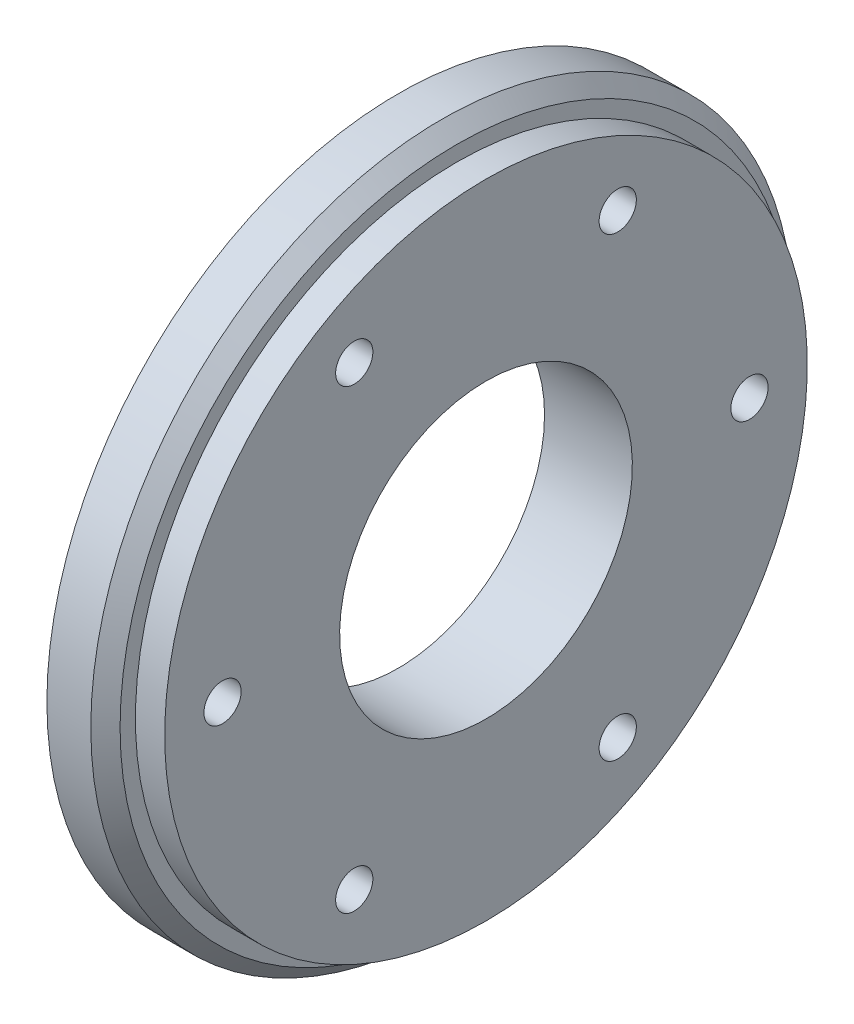
ISO-10303-21;
HEADER;
FILE_DESCRIPTION(('STEP AP214'),'2;1');
FILE_NAME('part.step','',(''),(''),'','','');
FILE_SCHEMA(('AUTOMOTIVE_DESIGN { 1 0 10303 214 1 1 1 1 }'));
ENDSEC;
DATA;
#1=APPLICATION_CONTEXT('core data for automotive mechanical design processes');
#2=APPLICATION_PROTOCOL_DEFINITION('international standard','automotive_design',2000,#1);
#3=PRODUCT_CONTEXT('',#1,'mechanical');
#4=PRODUCT('Part','Part','',(#3));
#5=PRODUCT_RELATED_PRODUCT_CATEGORY('part','',(#4));
#6=PRODUCT_DEFINITION_FORMATION('','',#4);
#7=PRODUCT_DEFINITION_CONTEXT('part definition',#1,'design');
#8=PRODUCT_DEFINITION('design','',#6,#7);
#9=PRODUCT_DEFINITION_SHAPE('','',#8);
#10=(LENGTH_UNIT() NAMED_UNIT(*) SI_UNIT(.MILLI.,.METRE.));
#11=(NAMED_UNIT(*) PLANE_ANGLE_UNIT() SI_UNIT($,.RADIAN.));
#12=(NAMED_UNIT(*) SI_UNIT($,.STERADIAN.) SOLID_ANGLE_UNIT());
#13=UNCERTAINTY_MEASURE_WITH_UNIT(LENGTH_MEASURE(1.E-05),#10,'distance_accuracy_value','');
#14=(GEOMETRIC_REPRESENTATION_CONTEXT(3) GLOBAL_UNCERTAINTY_ASSIGNED_CONTEXT((#13)) GLOBAL_UNIT_ASSIGNED_CONTEXT((#10,
#11,#12)) REPRESENTATION_CONTEXT('',''));
#15=CARTESIAN_POINT('',(0.,0.,0.));
#16=DIRECTION('',(0.,0.,1.));
#17=DIRECTION('',(1.,0.,0.));
#18=AXIS2_PLACEMENT_3D('',#15,#16,#17);
#19=CARTESIAN_POINT('',(3.175,0.,0.));
#20=DIRECTION('',(1.,0.,0.));
#21=DIRECTION('',(0.,0.,-1.));
#22=AXIS2_PLACEMENT_3D('',#19,#20,#21);
#23=PLANE('',#22);
#24=CARTESIAN_POINT('',(3.175,0.,0.));
#25=DIRECTION('',(1.,0.,0.));
#26=DIRECTION('',(0.,0.,-1.));
#27=AXIS2_PLACEMENT_3D('',#24,#25,#26);
#28=CIRCLE('',#27,36.5125);
#29=CARTESIAN_POINT('',(3.175,0.,-36.5125));
#30=VERTEX_POINT('',#29);
#31=EDGE_CURVE('E45',#30,#30,#28,.T.);
#32=ORIENTED_EDGE('',*,*,#31,.T.);
#33=EDGE_LOOP('',(#32));
#34=FACE_BOUND('',#33,.T.);
#35=CARTESIAN_POINT('',(3.175,0.,0.));
#36=DIRECTION('',(1.,0.,0.));
#37=DIRECTION('',(0.,1.,0.));
#38=AXIS2_PLACEMENT_3D('',#35,#36,#37);
#39=CIRCLE('',#38,34.8488);
#40=CARTESIAN_POINT('',(3.175,34.8488,0.));
#41=VERTEX_POINT('',#40);
#42=EDGE_CURVE('E49',#41,#41,#39,.T.);
#43=ORIENTED_EDGE('',*,*,#42,.F.);
#44=EDGE_LOOP('',(#43));
#45=FACE_BOUND('',#44,.T.);
#46=ADVANCED_FACE('F37',(#34,#45),#23,.T.);
#47=CARTESIAN_POINT('',(-3.175,0.,0.));
#48=DIRECTION('',(1.,0.,0.));
#49=DIRECTION('',(0.,0.,-1.));
#50=AXIS2_PLACEMENT_3D('',#47,#48,#49);
#51=PLANE('',#50);
#52=CARTESIAN_POINT('',(-3.175,0.,0.));
#53=DIRECTION('',(1.,0.,0.));
#54=DIRECTION('',(0.,0.,-1.));
#55=AXIS2_PLACEMENT_3D('',#52,#53,#54);
#56=CIRCLE('',#55,38.1);
#57=CARTESIAN_POINT('',(-3.175,0.,-38.1));
#58=VERTEX_POINT('',#57);
#59=EDGE_CURVE('E53',#58,#58,#56,.T.);
#60=ORIENTED_EDGE('',*,*,#59,.F.);
#61=EDGE_LOOP('',(#60));
#62=FACE_BOUND('',#61,.T.);
#63=CARTESIAN_POINT('',(-3.175,0.,0.));
#64=DIRECTION('',(1.,0.,0.));
#65=DIRECTION('',(0.,0.,-1.));
#66=AXIS2_PLACEMENT_3D('',#63,#64,#65);
#67=CIRCLE('',#66,15.875);
#68=CARTESIAN_POINT('',(-3.175,0.,-15.875));
#69=VERTEX_POINT('',#68);
#70=EDGE_CURVE('E58',#69,#69,#67,.T.);
#71=ORIENTED_EDGE('',*,*,#70,.T.);
#72=EDGE_LOOP('',(#71));
#73=FACE_BOUND('',#72,.T.);
#74=CARTESIAN_POINT('',(-3.175,24.7466759131403,-14.2875));
#75=DIRECTION('',(1.,0.,0.));
#76=DIRECTION('',(0.,0.,-1.));
#77=AXIS2_PLACEMENT_3D('',#74,#75,#76);
#78=CIRCLE('',#77,2.0193);
#79=CARTESIAN_POINT('',(-3.175,24.7466759131403,-16.3068));
#80=VERTEX_POINT('',#79);
#81=EDGE_CURVE('E61',#80,#80,#78,.T.);
#82=ORIENTED_EDGE('',*,*,#81,.T.);
#83=EDGE_LOOP('',(#82));
#84=FACE_BOUND('',#83,.T.);
#85=CARTESIAN_POINT('',(-3.175,0.,-28.575));
#86=DIRECTION('',(1.,0.,0.));
#87=DIRECTION('',(0.,0.,-1.));
#88=AXIS2_PLACEMENT_3D('',#85,#86,#87);
#89=CIRCLE('',#88,2.0193);
#90=CARTESIAN_POINT('',(-3.175,0.,-30.5943));
#91=VERTEX_POINT('',#90);
#92=EDGE_CURVE('E64',#91,#91,#89,.T.);
#93=ORIENTED_EDGE('',*,*,#92,.T.);
#94=EDGE_LOOP('',(#93));
#95=FACE_BOUND('',#94,.T.);
#96=CARTESIAN_POINT('',(-3.175,-24.7466759131403,-14.2875));
#97=DIRECTION('',(1.,0.,0.));
#98=DIRECTION('',(0.,0.,-1.));
#99=AXIS2_PLACEMENT_3D('',#96,#97,#98);
#100=CIRCLE('',#99,2.0193);
#101=CARTESIAN_POINT('',(-3.175,-24.7466759131403,-16.3068));
#102=VERTEX_POINT('',#101);
#103=EDGE_CURVE('E67',#102,#102,#100,.T.);
#104=ORIENTED_EDGE('',*,*,#103,.T.);
#105=EDGE_LOOP('',(#104));
#106=FACE_BOUND('',#105,.T.);
#107=CARTESIAN_POINT('',(-3.175,-24.7466759131403,14.2875));
#108=DIRECTION('',(1.,0.,0.));
#109=DIRECTION('',(0.,0.,-1.));
#110=AXIS2_PLACEMENT_3D('',#107,#108,#109);
#111=CIRCLE('',#110,2.0193);
#112=CARTESIAN_POINT('',(-3.175,-24.7466759131403,12.2682));
#113=VERTEX_POINT('',#112);
#114=EDGE_CURVE('E70',#113,#113,#111,.T.);
#115=ORIENTED_EDGE('',*,*,#114,.T.);
#116=EDGE_LOOP('',(#115));
#117=FACE_BOUND('',#116,.T.);
#118=CARTESIAN_POINT('',(-3.175,0.,28.575));
#119=DIRECTION('',(1.,0.,0.));
#120=DIRECTION('',(0.,0.,-1.));
#121=AXIS2_PLACEMENT_3D('',#118,#119,#120);
#122=CIRCLE('',#121,2.0193);
#123=CARTESIAN_POINT('',(-3.175,0.,26.5557));
#124=VERTEX_POINT('',#123);
#125=EDGE_CURVE('E73',#124,#124,#122,.T.);
#126=ORIENTED_EDGE('',*,*,#125,.T.);
#127=EDGE_LOOP('',(#126));
#128=FACE_BOUND('',#127,.T.);
#129=CARTESIAN_POINT('',(-3.175,24.7466759131404,14.2875));
#130=DIRECTION('',(1.,0.,0.));
#131=DIRECTION('',(0.,0.,-1.));
#132=AXIS2_PLACEMENT_3D('',#129,#130,#131);
#133=CIRCLE('',#132,2.0193);
#134=CARTESIAN_POINT('',(-3.175,24.7466759131404,12.2682));
#135=VERTEX_POINT('',#134);
#136=EDGE_CURVE('E76',#135,#135,#133,.T.);
#137=ORIENTED_EDGE('',*,*,#136,.T.);
#138=EDGE_LOOP('',(#137));
#139=FACE_BOUND('',#138,.T.);
#140=ADVANCED_FACE('F124',(#62,#73,#84,#95,#106,#117,#128,#139),#51,.F.);
#141=CARTESIAN_POINT('',(3.175,0.,0.));
#142=DIRECTION('',(-1.,0.,0.));
#143=DIRECTION('',(0.,0.,1.));
#144=AXIS2_PLACEMENT_3D('',#141,#142,#143);
#145=CYLINDRICAL_SURFACE('',#144,38.1);
#146=CARTESIAN_POINT('',(1.5875,0.,0.));
#147=DIRECTION('',(1.,0.,0.));
#148=DIRECTION('',(0.,0.,-1.));
#149=AXIS2_PLACEMENT_3D('',#146,#147,#148);
#150=CIRCLE('',#149,38.1);
#151=CARTESIAN_POINT('',(1.5875,0.,-38.1));
#152=VERTEX_POINT('',#151);
#153=EDGE_CURVE('E10',#152,#152,#150,.F.);
#154=ORIENTED_EDGE('',*,*,#153,.T.);
#155=EDGE_LOOP('',(#154));
#156=FACE_BOUND('',#155,.T.);
#157=ORIENTED_EDGE('',*,*,#59,.T.);
#158=EDGE_LOOP('',(#157));
#159=FACE_BOUND('',#158,.T.);
#160=ADVANCED_FACE('F131',(#156,#159),#145,.T.);
#161=CARTESIAN_POINT('',(3.175,0.,0.));
#162=DIRECTION('',(-1.,0.,0.));
#163=DIRECTION('',(0.,0.,1.));
#164=AXIS2_PLACEMENT_3D('',#161,#162,#163);
#165=CYLINDRICAL_SURFACE('',#164,15.875);
#166=ORIENTED_EDGE('',*,*,#70,.F.);
#167=EDGE_LOOP('',(#166));
#168=FACE_BOUND('',#167,.T.);
#169=CARTESIAN_POINT('',(6.35,0.,0.));
#170=DIRECTION('',(1.,0.,0.));
#171=DIRECTION('',(0.,1.,0.));
#172=AXIS2_PLACEMENT_3D('',#169,#170,#171);
#173=CIRCLE('',#172,15.875);
#174=CARTESIAN_POINT('',(6.35,15.875,0.));
#175=VERTEX_POINT('',#174);
#176=EDGE_CURVE('E82',#175,#175,#173,.T.);
#177=ORIENTED_EDGE('',*,*,#176,.T.);
#178=EDGE_LOOP('',(#177));
#179=FACE_BOUND('',#178,.T.);
#180=ADVANCED_FACE('F136',(#168,#179),#165,.F.);
#181=CARTESIAN_POINT('',(3.175,24.7466759131403,-14.2875));
#182=DIRECTION('',(-1.,0.,0.));
#183=DIRECTION('',(0.,0.,1.));
#184=AXIS2_PLACEMENT_3D('',#181,#182,#183);
#185=CYLINDRICAL_SURFACE('',#184,2.0193);
#186=ORIENTED_EDGE('',*,*,#81,.F.);
#187=EDGE_LOOP('',(#186));
#188=FACE_BOUND('',#187,.T.);
#189=CARTESIAN_POINT('',(6.35,24.7466759131403,-14.2875));
#190=DIRECTION('',(1.,0.,0.));
#191=DIRECTION('',(0.,1.,0.));
#192=AXIS2_PLACEMENT_3D('',#189,#190,#191);
#193=CIRCLE('',#192,2.01929999999997);
#194=CARTESIAN_POINT('',(6.35,26.7659759131403,-14.2875));
#195=VERTEX_POINT('',#194);
#196=EDGE_CURVE('E91',#195,#195,#193,.T.);
#197=ORIENTED_EDGE('',*,*,#196,.T.);
#198=EDGE_LOOP('',(#197));
#199=FACE_BOUND('',#198,.T.);
#200=ADVANCED_FACE('F142',(#188,#199),#185,.F.);
#201=CARTESIAN_POINT('',(3.175,0.,-28.575));
#202=DIRECTION('',(-1.,0.,0.));
#203=DIRECTION('',(0.,0.,1.));
#204=AXIS2_PLACEMENT_3D('',#201,#202,#203);
#205=CYLINDRICAL_SURFACE('',#204,2.0193);
#206=ORIENTED_EDGE('',*,*,#92,.F.);
#207=EDGE_LOOP('',(#206));
#208=FACE_BOUND('',#207,.T.);
#209=CARTESIAN_POINT('',(6.35,0.,-28.575));
#210=DIRECTION('',(1.,0.,0.));
#211=DIRECTION('',(0.,1.,0.));
#212=AXIS2_PLACEMENT_3D('',#209,#210,#211);
#213=CIRCLE('',#212,2.01929999999998);
#214=CARTESIAN_POINT('',(6.35,2.01929999999998,-28.575));
#215=VERTEX_POINT('',#214);
#216=EDGE_CURVE('E94',#215,#215,#213,.T.);
#217=ORIENTED_EDGE('',*,*,#216,.T.);
#218=EDGE_LOOP('',(#217));
#219=FACE_BOUND('',#218,.T.);
#220=ADVANCED_FACE('F166',(#208,#219),#205,.F.);
#221=CARTESIAN_POINT('',(3.175,-24.7466759131403,-14.2875));
#222=DIRECTION('',(-1.,0.,0.));
#223=DIRECTION('',(0.,0.,1.));
#224=AXIS2_PLACEMENT_3D('',#221,#222,#223);
#225=CYLINDRICAL_SURFACE('',#224,2.0193);
#226=ORIENTED_EDGE('',*,*,#103,.F.);
#227=EDGE_LOOP('',(#226));
#228=FACE_BOUND('',#227,.T.);
#229=CARTESIAN_POINT('',(6.35,-24.7466759131403,-14.2875));
#230=DIRECTION('',(1.,0.,0.));
#231=DIRECTION('',(0.,1.,0.));
#232=AXIS2_PLACEMENT_3D('',#229,#230,#231);
#233=CIRCLE('',#232,2.0193);
#234=CARTESIAN_POINT('',(6.35,-22.7273759131403,-14.2875));
#235=VERTEX_POINT('',#234);
#236=EDGE_CURVE('E97',#235,#235,#233,.T.);
#237=ORIENTED_EDGE('',*,*,#236,.T.);
#238=EDGE_LOOP('',(#237));
#239=FACE_BOUND('',#238,.T.);
#240=ADVANCED_FACE('F168',(#228,#239),#225,.F.);
#241=CARTESIAN_POINT('',(3.175,-24.7466759131403,14.2875));
#242=DIRECTION('',(-1.,0.,0.));
#243=DIRECTION('',(0.,0.,1.));
#244=AXIS2_PLACEMENT_3D('',#241,#242,#243);
#245=CYLINDRICAL_SURFACE('',#244,2.0193);
#246=ORIENTED_EDGE('',*,*,#114,.F.);
#247=EDGE_LOOP('',(#246));
#248=FACE_BOUND('',#247,.T.);
#249=CARTESIAN_POINT('',(6.35,-24.7466759131403,14.2875));
#250=DIRECTION('',(1.,0.,0.));
#251=DIRECTION('',(0.,1.,0.));
#252=AXIS2_PLACEMENT_3D('',#249,#250,#251);
#253=CIRCLE('',#252,2.01930000000001);
#254=CARTESIAN_POINT('',(6.35,-22.7273759131403,14.2875));
#255=VERTEX_POINT('',#254);
#256=EDGE_CURVE('E100',#255,#255,#253,.T.);
#257=ORIENTED_EDGE('',*,*,#256,.T.);
#258=EDGE_LOOP('',(#257));
#259=FACE_BOUND('',#258,.T.);
#260=ADVANCED_FACE('F104',(#248,#259),#245,.F.);
#261=CARTESIAN_POINT('',(3.175,0.,28.575));
#262=DIRECTION('',(-1.,0.,0.));
#263=DIRECTION('',(0.,0.,1.));
#264=AXIS2_PLACEMENT_3D('',#261,#262,#263);
#265=CYLINDRICAL_SURFACE('',#264,2.0193);
#266=ORIENTED_EDGE('',*,*,#125,.F.);
#267=EDGE_LOOP('',(#266));
#268=FACE_BOUND('',#267,.T.);
#269=CARTESIAN_POINT('',(6.35,0.,28.575));
#270=DIRECTION('',(1.,0.,0.));
#271=DIRECTION('',(0.,1.,0.));
#272=AXIS2_PLACEMENT_3D('',#269,#270,#271);
#273=CIRCLE('',#272,2.01930000000001);
#274=CARTESIAN_POINT('',(6.35,2.01930000000001,28.575));
#275=VERTEX_POINT('',#274);
#276=EDGE_CURVE('E85',#275,#275,#273,.T.);
#277=ORIENTED_EDGE('',*,*,#276,.T.);
#278=EDGE_LOOP('',(#277));
#279=FACE_BOUND('',#278,.T.);
#280=ADVANCED_FACE('F118',(#268,#279),#265,.F.);
#281=CARTESIAN_POINT('',(3.175,24.7466759131404,14.2875));
#282=DIRECTION('',(-1.,0.,0.));
#283=DIRECTION('',(0.,0.,1.));
#284=AXIS2_PLACEMENT_3D('',#281,#282,#283);
#285=CYLINDRICAL_SURFACE('',#284,2.0193);
#286=ORIENTED_EDGE('',*,*,#136,.F.);
#287=EDGE_LOOP('',(#286));
#288=FACE_BOUND('',#287,.T.);
#289=CARTESIAN_POINT('',(6.35,24.7466759131404,14.2875));
#290=DIRECTION('',(1.,0.,0.));
#291=DIRECTION('',(0.,1.,0.));
#292=AXIS2_PLACEMENT_3D('',#289,#290,#291);
#293=CIRCLE('',#292,2.0193);
#294=CARTESIAN_POINT('',(6.35,26.7659759131403,14.2875));
#295=VERTEX_POINT('',#294);
#296=EDGE_CURVE('E88',#295,#295,#293,.T.);
#297=ORIENTED_EDGE('',*,*,#296,.T.);
#298=EDGE_LOOP('',(#297));
#299=FACE_BOUND('',#298,.T.);
#300=ADVANCED_FACE('F109',(#288,#299),#285,.F.);
#301=CARTESIAN_POINT('',(6.35,0.,0.));
#302=DIRECTION('',(1.,0.,0.));
#303=DIRECTION('',(0.,1.,0.));
#304=AXIS2_PLACEMENT_3D('',#301,#302,#303);
#305=PLANE('',#304);
#306=ORIENTED_EDGE('',*,*,#236,.F.);
#307=EDGE_LOOP('',(#306));
#308=FACE_BOUND('',#307,.T.);
#309=ORIENTED_EDGE('',*,*,#196,.F.);
#310=EDGE_LOOP('',(#309));
#311=FACE_BOUND('',#310,.T.);
#312=ORIENTED_EDGE('',*,*,#276,.F.);
#313=EDGE_LOOP('',(#312));
#314=FACE_BOUND('',#313,.T.);
#315=CARTESIAN_POINT('',(6.35,0.,0.));
#316=DIRECTION('',(1.,0.,0.));
#317=DIRECTION('',(0.,1.,0.));
#318=AXIS2_PLACEMENT_3D('',#315,#316,#317);
#319=CIRCLE('',#318,34.8488);
#320=CARTESIAN_POINT('',(6.35,34.8488,0.));
#321=VERTEX_POINT('',#320);
#322=EDGE_CURVE('E78',#321,#321,#319,.T.);
#323=ORIENTED_EDGE('',*,*,#322,.T.);
#324=EDGE_LOOP('',(#323));
#325=FACE_BOUND('',#324,.T.);
#326=ORIENTED_EDGE('',*,*,#176,.F.);
#327=EDGE_LOOP('',(#326));
#328=FACE_BOUND('',#327,.T.);
#329=ORIENTED_EDGE('',*,*,#296,.F.);
#330=EDGE_LOOP('',(#329));
#331=FACE_BOUND('',#330,.T.);
#332=ORIENTED_EDGE('',*,*,#216,.F.);
#333=EDGE_LOOP('',(#332));
#334=FACE_BOUND('',#333,.T.);
#335=ORIENTED_EDGE('',*,*,#256,.F.);
#336=EDGE_LOOP('',(#335));
#337=FACE_BOUND('',#336,.T.);
#338=ADVANCED_FACE('F106',(#308,#311,#314,#325,#328,#331,#334,#337),#305,.T.);
#339=CARTESIAN_POINT('',(6.35,0.,0.));
#340=DIRECTION('',(-1.,0.,0.));
#341=DIRECTION('',(0.,-1.,0.));
#342=AXIS2_PLACEMENT_3D('',#339,#340,#341);
#343=CYLINDRICAL_SURFACE('',#342,34.8488);
#344=ORIENTED_EDGE('',*,*,#322,.F.);
#345=EDGE_LOOP('',(#344));
#346=FACE_BOUND('',#345,.T.);
#347=ORIENTED_EDGE('',*,*,#42,.T.);
#348=EDGE_LOOP('',(#347));
#349=FACE_BOUND('',#348,.T.);
#350=ADVANCED_FACE('F108',(#346,#349),#343,.T.);
#351=CARTESIAN_POINT('',(3.175,0.,0.));
#352=DIRECTION('',(-1.,0.,0.));
#353=DIRECTION('',(0.,0.,1.));
#354=AXIS2_PLACEMENT_3D('',#351,#352,#353);
#355=CONICAL_SURFACE('',#354,36.5125,0.785398163397444);
#356=ORIENTED_EDGE('',*,*,#153,.F.);
#357=EDGE_LOOP('',(#356));
#358=FACE_BOUND('',#357,.T.);
#359=ORIENTED_EDGE('',*,*,#31,.F.);
#360=EDGE_LOOP('',(#359));
#361=FACE_BOUND('',#360,.T.);
#362=ADVANCED_FACE('F40',(#358,#361),#355,.T.);
#363=CLOSED_SHELL('',(#46,#140,#160,#180,#200,#220,#240,#260,#280,#300,#338,#350,#362));
#364=MANIFOLD_SOLID_BREP('B2',#363);
#365=ADVANCED_BREP_SHAPE_REPRESENTATION('',(#18,#364),#14);
#366=SHAPE_DEFINITION_REPRESENTATION(#9,#365);
ENDSEC;
END-ISO-10303-21;
